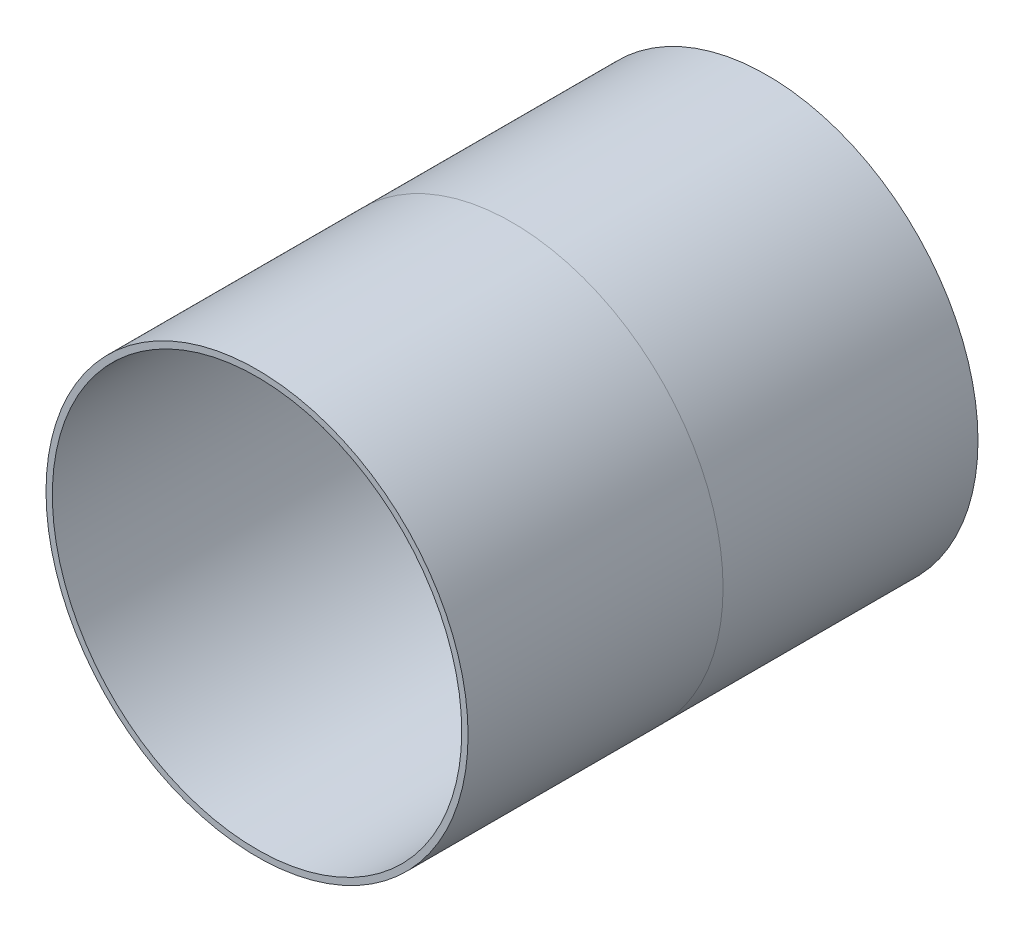
ISO-10303-21;
HEADER;
FILE_DESCRIPTION(('STEP AP214'),'2;1');
FILE_NAME('part.step','',(''),(''),'','','');
FILE_SCHEMA(('AUTOMOTIVE_DESIGN { 1 0 10303 214 1 1 1 1 }'));
ENDSEC;
DATA;
#1=APPLICATION_CONTEXT('core data for automotive mechanical design processes');
#2=APPLICATION_PROTOCOL_DEFINITION('international standard','automotive_design',2000,#1);
#3=PRODUCT_CONTEXT('',#1,'mechanical');
#4=PRODUCT('Part','Part','',(#3));
#5=PRODUCT_RELATED_PRODUCT_CATEGORY('part','',(#4));
#6=PRODUCT_DEFINITION_FORMATION('','',#4);
#7=PRODUCT_DEFINITION_CONTEXT('part definition',#1,'design');
#8=PRODUCT_DEFINITION('design','',#6,#7);
#9=PRODUCT_DEFINITION_SHAPE('','',#8);
#10=(LENGTH_UNIT() NAMED_UNIT(*) SI_UNIT(.MILLI.,.METRE.));
#11=(NAMED_UNIT(*) PLANE_ANGLE_UNIT() SI_UNIT($,.RADIAN.));
#12=(NAMED_UNIT(*) SI_UNIT($,.STERADIAN.) SOLID_ANGLE_UNIT());
#13=UNCERTAINTY_MEASURE_WITH_UNIT(LENGTH_MEASURE(1.E-05),#10,'distance_accuracy_value','');
#14=(GEOMETRIC_REPRESENTATION_CONTEXT(3) GLOBAL_UNCERTAINTY_ASSIGNED_CONTEXT((#13)) GLOBAL_UNIT_ASSIGNED_CONTEXT((#10,
#11,#12)) REPRESENTATION_CONTEXT('',''));
#15=CARTESIAN_POINT('',(0.,0.,0.));
#16=DIRECTION('',(0.,0.,1.));
#17=DIRECTION('',(1.,0.,0.));
#18=AXIS2_PLACEMENT_3D('',#15,#16,#17);
#19=CARTESIAN_POINT('',(0.,0.,0.));
#20=DIRECTION('',(0.,0.,1.));
#21=DIRECTION('',(1.,0.,0.));
#22=AXIS2_PLACEMENT_3D('',#19,#20,#21);
#23=PLANE('',#22);
#24=CARTESIAN_POINT('',(0.,0.,0.));
#25=DIRECTION('',(0.,0.,1.));
#26=DIRECTION('',(1.,0.,0.));
#27=AXIS2_PLACEMENT_3D('',#24,#25,#26);
#28=CIRCLE('',#27,76.1746);
#29=CARTESIAN_POINT('',(76.1746,0.,0.));
#30=VERTEX_POINT('',#29);
#31=EDGE_CURVE('E45',#30,#30,#28,.T.);
#32=ORIENTED_EDGE('',*,*,#31,.F.);
#33=EDGE_LOOP('',(#32));
#34=FACE_BOUND('',#33,.T.);
#35=CARTESIAN_POINT('',(0.,0.,0.));
#36=DIRECTION('',(0.,0.,1.));
#37=DIRECTION('',(1.,0.,0.));
#38=AXIS2_PLACEMENT_3D('',#35,#36,#37);
#39=CIRCLE('',#38,73.914);
#40=CARTESIAN_POINT('',(73.914,0.,0.));
#41=VERTEX_POINT('',#40);
#42=EDGE_CURVE('E52',#41,#41,#39,.T.);
#43=ORIENTED_EDGE('',*,*,#42,.T.);
#44=EDGE_LOOP('',(#43));
#45=FACE_BOUND('',#44,.T.);
#46=ADVANCED_FACE('F41',(#34,#45),#23,.F.);
#47=CARTESIAN_POINT('',(0.,0.,92.075));
#48=DIRECTION('',(0.,0.,-1.));
#49=DIRECTION('',(-1.,0.,0.));
#50=AXIS2_PLACEMENT_3D('',#47,#48,#49);
#51=CYLINDRICAL_SURFACE('',#50,76.1746);
#52=CARTESIAN_POINT('',(0.,0.,92.075));
#53=DIRECTION('',(0.,0.,1.));
#54=DIRECTION('',(1.,0.,0.));
#55=AXIS2_PLACEMENT_3D('',#52,#53,#54);
#56=CIRCLE('',#55,76.1746);
#57=CARTESIAN_POINT('',(76.1746,0.,92.075));
#58=VERTEX_POINT('',#57);
#59=EDGE_CURVE('E10',#58,#58,#56,.T.);
#60=ORIENTED_EDGE('',*,*,#59,.F.);
#61=EDGE_LOOP('',(#60));
#62=FACE_BOUND('',#61,.T.);
#63=ORIENTED_EDGE('',*,*,#31,.T.);
#64=EDGE_LOOP('',(#63));
#65=FACE_BOUND('',#64,.T.);
#66=ADVANCED_FACE('F43',(#62,#65),#51,.T.);
#67=CARTESIAN_POINT('',(0.,0.,92.075));
#68=DIRECTION('',(0.,0.,-1.));
#69=DIRECTION('',(-1.,0.,0.));
#70=AXIS2_PLACEMENT_3D('',#67,#68,#69);
#71=CYLINDRICAL_SURFACE('',#70,73.914);
#72=ORIENTED_EDGE('',*,*,#42,.F.);
#73=EDGE_LOOP('',(#72));
#74=FACE_BOUND('',#73,.T.);
#75=CARTESIAN_POINT('',(0.,0.,184.15));
#76=DIRECTION('',(0.,0.,1.));
#77=DIRECTION('',(1.,0.,0.));
#78=AXIS2_PLACEMENT_3D('',#75,#76,#77);
#79=CIRCLE('',#78,73.914);
#80=CARTESIAN_POINT('',(73.914,0.,184.15));
#81=VERTEX_POINT('',#80);
#82=EDGE_CURVE('E60',#81,#81,#79,.T.);
#83=ORIENTED_EDGE('',*,*,#82,.T.);
#84=EDGE_LOOP('',(#83));
#85=FACE_BOUND('',#84,.T.);
#86=ADVANCED_FACE('F66',(#74,#85),#71,.F.);
#87=CARTESIAN_POINT('',(0.,0.,184.15));
#88=DIRECTION('',(0.,0.,1.));
#89=DIRECTION('',(1.,0.,0.));
#90=AXIS2_PLACEMENT_3D('',#87,#88,#89);
#91=PLANE('',#90);
#92=CARTESIAN_POINT('',(0.,0.,184.15));
#93=DIRECTION('',(0.,0.,1.));
#94=DIRECTION('',(1.,0.,0.));
#95=AXIS2_PLACEMENT_3D('',#92,#93,#94);
#96=CIRCLE('',#95,76.2);
#97=CARTESIAN_POINT('',(76.2,0.,184.15));
#98=VERTEX_POINT('',#97);
#99=EDGE_CURVE('E56',#98,#98,#96,.T.);
#100=ORIENTED_EDGE('',*,*,#99,.T.);
#101=EDGE_LOOP('',(#100));
#102=FACE_BOUND('',#101,.T.);
#103=ORIENTED_EDGE('',*,*,#82,.F.);
#104=EDGE_LOOP('',(#103));
#105=FACE_BOUND('',#104,.T.);
#106=ADVANCED_FACE('F68',(#102,#105),#91,.T.);
#107=CARTESIAN_POINT('',(0.,0.,92.075));
#108=DIRECTION('',(0.,0.,1.));
#109=DIRECTION('',(1.,0.,0.));
#110=AXIS2_PLACEMENT_3D('',#107,#108,#109);
#111=PLANE('',#110);
#112=ORIENTED_EDGE('',*,*,#59,.T.);
#113=EDGE_LOOP('',(#112));
#114=FACE_BOUND('',#113,.T.);
#115=CARTESIAN_POINT('',(0.,0.,92.075));
#116=DIRECTION('',(0.,0.,1.));
#117=DIRECTION('',(1.,0.,0.));
#118=AXIS2_PLACEMENT_3D('',#115,#116,#117);
#119=CIRCLE('',#118,76.2);
#120=CARTESIAN_POINT('',(76.2,0.,92.075));
#121=VERTEX_POINT('',#120);
#122=EDGE_CURVE('E57',#121,#121,#119,.T.);
#123=ORIENTED_EDGE('',*,*,#122,.F.);
#124=EDGE_LOOP('',(#123));
#125=FACE_BOUND('',#124,.T.);
#126=ADVANCED_FACE('F70',(#114,#125),#111,.F.);
#127=CARTESIAN_POINT('',(0.,0.,184.15));
#128=DIRECTION('',(0.,0.,-1.));
#129=DIRECTION('',(-1.,0.,0.));
#130=AXIS2_PLACEMENT_3D('',#127,#128,#129);
#131=CYLINDRICAL_SURFACE('',#130,76.2);
#132=ORIENTED_EDGE('',*,*,#99,.F.);
#133=EDGE_LOOP('',(#132));
#134=FACE_BOUND('',#133,.T.);
#135=ORIENTED_EDGE('',*,*,#122,.T.);
#136=EDGE_LOOP('',(#135));
#137=FACE_BOUND('',#136,.T.);
#138=ADVANCED_FACE('F77',(#134,#137),#131,.T.);
#139=CLOSED_SHELL('',(#46,#66,#86,#106,#126,#138));
#140=MANIFOLD_SOLID_BREP('B2',#139);
#141=ADVANCED_BREP_SHAPE_REPRESENTATION('',(#18,#140),#14);
#142=SHAPE_DEFINITION_REPRESENTATION(#9,#141);
ENDSEC;
END-ISO-10303-21;
